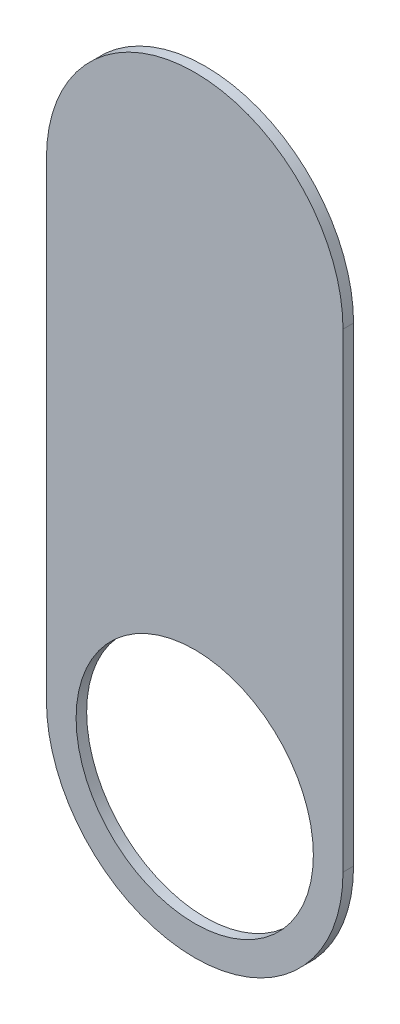
ISO-10303-21;
HEADER;
FILE_DESCRIPTION(('STEP AP214'),'2;1');
FILE_NAME('part.step','',(''),(''),'','','');
FILE_SCHEMA(('AUTOMOTIVE_DESIGN { 1 0 10303 214 1 1 1 1 }'));
ENDSEC;
DATA;
#1=APPLICATION_CONTEXT('core data for automotive mechanical design processes');
#2=APPLICATION_PROTOCOL_DEFINITION('international standard','automotive_design',2000,#1);
#3=PRODUCT_CONTEXT('',#1,'mechanical');
#4=PRODUCT('Part','Part','',(#3));
#5=PRODUCT_RELATED_PRODUCT_CATEGORY('part','',(#4));
#6=PRODUCT_DEFINITION_FORMATION('','',#4);
#7=PRODUCT_DEFINITION_CONTEXT('part definition',#1,'design');
#8=PRODUCT_DEFINITION('design','',#6,#7);
#9=PRODUCT_DEFINITION_SHAPE('','',#8);
#10=(LENGTH_UNIT() NAMED_UNIT(*) SI_UNIT(.MILLI.,.METRE.));
#11=(NAMED_UNIT(*) PLANE_ANGLE_UNIT() SI_UNIT($,.RADIAN.));
#12=(NAMED_UNIT(*) SI_UNIT($,.STERADIAN.) SOLID_ANGLE_UNIT());
#13=UNCERTAINTY_MEASURE_WITH_UNIT(LENGTH_MEASURE(1.E-05),#10,'distance_accuracy_value','');
#14=(GEOMETRIC_REPRESENTATION_CONTEXT(3) GLOBAL_UNCERTAINTY_ASSIGNED_CONTEXT((#13)) GLOBAL_UNIT_ASSIGNED_CONTEXT((#10,
#11,#12)) REPRESENTATION_CONTEXT('',''));
#15=CARTESIAN_POINT('',(0.,0.,0.));
#16=DIRECTION('',(0.,0.,1.));
#17=DIRECTION('',(1.,0.,0.));
#18=AXIS2_PLACEMENT_3D('',#15,#16,#17);
#19=CARTESIAN_POINT('',(57.920001,75.3000272,0.));
#20=DIRECTION('',(-1.,0.,0.));
#21=DIRECTION('',(0.,1.,0.));
#22=AXIS2_PLACEMENT_3D('',#19,#20,#21);
#23=PLANE('',#22);
#24=DIRECTION('',(0.,1.,0.));
#25=VECTOR('',#24,1.);
#26=CARTESIAN_POINT('',(57.920001,75.3000272,0.03556));
#27=LINE('',#26,#25);
#28=CARTESIAN_POINT('',(57.920001,75.3000272,0.03556));
#29=VERTEX_POINT('',#28);
#30=CARTESIAN_POINT('',(57.920001,76.8858,0.03556));
#31=VERTEX_POINT('',#30);
#32=EDGE_CURVE('E11',#29,#31,#27,.T.);
#33=ORIENTED_EDGE('',*,*,#32,.F.);
#34=DIRECTION('',(0.,0.,1.));
#35=VECTOR('',#34,1.);
#36=CARTESIAN_POINT('',(57.920001,75.3000272,0.));
#37=LINE('',#36,#35);
#38=CARTESIAN_POINT('',(57.920001,75.3000272,0.));
#39=VERTEX_POINT('',#38);
#40=EDGE_CURVE('E24',#39,#29,#37,.T.);
#41=ORIENTED_EDGE('',*,*,#40,.F.);
#42=DIRECTION('',(0.,1.,0.));
#43=VECTOR('',#42,1.);
#44=CARTESIAN_POINT('',(57.920001,75.3000272,0.));
#45=LINE('',#44,#43);
#46=CARTESIAN_POINT('',(57.920001,76.8858,0.));
#47=VERTEX_POINT('',#46);
#48=EDGE_CURVE('E96',#39,#47,#45,.T.);
#49=ORIENTED_EDGE('',*,*,#48,.T.);
#50=DIRECTION('',(0.,0.,1.));
#51=VECTOR('',#50,1.);
#52=CARTESIAN_POINT('',(57.920001,76.8858,0.));
#53=LINE('',#52,#51);
#54=EDGE_CURVE('E37',#47,#31,#53,.T.);
#55=ORIENTED_EDGE('',*,*,#54,.T.);
#56=EDGE_LOOP('',(#33,#41,#49,#55));
#57=FACE_BOUND('',#56,.T.);
#58=ADVANCED_FACE('F17',(#57),#23,.F.);
#59=CARTESIAN_POINT('',(57.420002,75.3000272,0.));
#60=DIRECTION('',(0.,0.,-1.));
#61=DIRECTION('',(-1.,0.,0.));
#62=AXIS2_PLACEMENT_3D('',#59,#60,#61);
#63=CYLINDRICAL_SURFACE('',#62,0.499999);
#64=CARTESIAN_POINT('',(57.420002,75.3000272,0.03556));
#65=DIRECTION('',(0.,0.,1.));
#66=DIRECTION('',(-1.,0.,0.));
#67=AXIS2_PLACEMENT_3D('',#64,#65,#66);
#68=CIRCLE('',#67,0.499999);
#69=CARTESIAN_POINT('',(56.920003,75.3000272,0.03556));
#70=VERTEX_POINT('',#69);
#71=EDGE_CURVE('E92',#70,#29,#68,.T.);
#72=ORIENTED_EDGE('',*,*,#71,.F.);
#73=DIRECTION('',(0.,0.,1.));
#74=VECTOR('',#73,1.);
#75=CARTESIAN_POINT('',(56.920003,75.3000272,0.));
#76=LINE('',#75,#74);
#77=CARTESIAN_POINT('',(56.920003,75.3000272,0.));
#78=VERTEX_POINT('',#77);
#79=EDGE_CURVE('E90',#78,#70,#76,.T.);
#80=ORIENTED_EDGE('',*,*,#79,.F.);
#81=CARTESIAN_POINT('',(57.420002,75.3000272,0.));
#82=DIRECTION('',(0.,0.,1.));
#83=DIRECTION('',(-1.,0.,0.));
#84=AXIS2_PLACEMENT_3D('',#81,#82,#83);
#85=CIRCLE('',#84,0.499999);
#86=EDGE_CURVE('E88',#78,#39,#85,.T.);
#87=ORIENTED_EDGE('',*,*,#86,.T.);
#88=ORIENTED_EDGE('',*,*,#40,.T.);
#89=EDGE_LOOP('',(#72,#80,#87,#88));
#90=FACE_BOUND('',#89,.T.);
#91=ADVANCED_FACE('F111',(#90),#63,.T.);
#92=CARTESIAN_POINT('',(57.420002,76.8858,0.));
#93=DIRECTION('',(0.,0.,-1.));
#94=DIRECTION('',(1.,0.,0.));
#95=AXIS2_PLACEMENT_3D('',#92,#93,#94);
#96=CYLINDRICAL_SURFACE('',#95,0.499999);
#97=CARTESIAN_POINT('',(57.420002,76.8858,0.03556));
#98=DIRECTION('',(0.,0.,1.));
#99=DIRECTION('',(1.,0.,0.));
#100=AXIS2_PLACEMENT_3D('',#97,#98,#99);
#101=CIRCLE('',#100,0.499999);
#102=CARTESIAN_POINT('',(56.920003,76.8858,0.03556));
#103=VERTEX_POINT('',#102);
#104=EDGE_CURVE('E85',#31,#103,#101,.T.);
#105=ORIENTED_EDGE('',*,*,#104,.F.);
#106=ORIENTED_EDGE('',*,*,#54,.F.);
#107=CARTESIAN_POINT('',(57.420002,76.8858,0.));
#108=DIRECTION('',(0.,0.,1.));
#109=DIRECTION('',(1.,0.,0.));
#110=AXIS2_PLACEMENT_3D('',#107,#108,#109);
#111=CIRCLE('',#110,0.499999);
#112=CARTESIAN_POINT('',(56.920003,76.8858,0.));
#113=VERTEX_POINT('',#112);
#114=EDGE_CURVE('E82',#47,#113,#111,.T.);
#115=ORIENTED_EDGE('',*,*,#114,.T.);
#116=DIRECTION('',(0.,0.,1.));
#117=VECTOR('',#116,1.);
#118=CARTESIAN_POINT('',(56.920003,76.8858,0.));
#119=LINE('',#118,#117);
#120=EDGE_CURVE('E80',#113,#103,#119,.T.);
#121=ORIENTED_EDGE('',*,*,#120,.T.);
#122=EDGE_LOOP('',(#105,#106,#115,#121));
#123=FACE_BOUND('',#122,.T.);
#124=ADVANCED_FACE('F104',(#123),#96,.T.);
#125=CARTESIAN_POINT('',(56.920003,76.8858,0.));
#126=DIRECTION('',(1.,0.,0.));
#127=DIRECTION('',(0.,-1.,0.));
#128=AXIS2_PLACEMENT_3D('',#125,#126,#127);
#129=PLANE('',#128);
#130=DIRECTION('',(0.,-1.,0.));
#131=VECTOR('',#130,1.);
#132=CARTESIAN_POINT('',(56.920003,76.8858,0.03556));
#133=LINE('',#132,#131);
#134=EDGE_CURVE('E77',#103,#70,#133,.T.);
#135=ORIENTED_EDGE('',*,*,#134,.F.);
#136=ORIENTED_EDGE('',*,*,#120,.F.);
#137=DIRECTION('',(0.,-1.,0.));
#138=VECTOR('',#137,1.);
#139=CARTESIAN_POINT('',(56.920003,76.8858,0.));
#140=LINE('',#139,#138);
#141=EDGE_CURVE('E68',#113,#78,#140,.T.);
#142=ORIENTED_EDGE('',*,*,#141,.T.);
#143=ORIENTED_EDGE('',*,*,#79,.T.);
#144=EDGE_LOOP('',(#135,#136,#142,#143));
#145=FACE_BOUND('',#144,.T.);
#146=ADVANCED_FACE('F110',(#145),#129,.F.);
#147=CARTESIAN_POINT('',(57.420002,75.3000272,0.));
#148=DIRECTION('',(0.,0.,-1.));
#149=DIRECTION('',(1.,0.,0.));
#150=AXIS2_PLACEMENT_3D('',#147,#148,#149);
#151=CYLINDRICAL_SURFACE('',#150,0.3999992);
#152=DIRECTION('',(0.,0.,1.));
#153=VECTOR('',#152,1.);
#154=CARTESIAN_POINT('',(57.8200012,75.3000272,0.));
#155=LINE('',#154,#153);
#156=CARTESIAN_POINT('',(57.8200012,75.3000272,0.));
#157=VERTEX_POINT('',#156);
#158=CARTESIAN_POINT('',(57.8200012,75.3000272,0.03556));
#159=VERTEX_POINT('',#158);
#160=EDGE_CURVE('E62',#157,#159,#155,.T.);
#161=ORIENTED_EDGE('',*,*,#160,.T.);
#162=CARTESIAN_POINT('',(57.420002,75.3000272,0.03556));
#163=DIRECTION('',(0.,0.,1.));
#164=DIRECTION('',(1.,0.,0.));
#165=AXIS2_PLACEMENT_3D('',#162,#163,#164);
#166=CIRCLE('',#165,0.3999992);
#167=EDGE_CURVE('E67',#159,#159,#166,.T.);
#168=ORIENTED_EDGE('',*,*,#167,.T.);
#169=ORIENTED_EDGE('',*,*,#160,.F.);
#170=CARTESIAN_POINT('',(57.420002,75.3000272,0.));
#171=DIRECTION('',(0.,0.,1.));
#172=DIRECTION('',(1.,0.,0.));
#173=AXIS2_PLACEMENT_3D('',#170,#171,#172);
#174=CIRCLE('',#173,0.3999992);
#175=EDGE_CURVE('E65',#157,#157,#174,.T.);
#176=ORIENTED_EDGE('',*,*,#175,.F.);
#177=EDGE_LOOP('',(#161,#168,#169,#176));
#178=FACE_BOUND('',#177,.T.);
#179=ADVANCED_FACE('F64',(#178),#151,.F.);
#180=CARTESIAN_POINT('',(57.920001,75.3000272,0.));
#181=DIRECTION('',(0.,0.,-1.));
#182=DIRECTION('',(-1.,0.,0.));
#183=AXIS2_PLACEMENT_3D('',#180,#181,#182);
#184=PLANE('',#183);
#185=ORIENTED_EDGE('',*,*,#48,.F.);
#186=ORIENTED_EDGE('',*,*,#86,.F.);
#187=ORIENTED_EDGE('',*,*,#141,.F.);
#188=ORIENTED_EDGE('',*,*,#114,.F.);
#189=EDGE_LOOP('',(#185,#186,#187,#188));
#190=FACE_BOUND('',#189,.T.);
#191=ORIENTED_EDGE('',*,*,#175,.T.);
#192=EDGE_LOOP('',(#191));
#193=FACE_BOUND('',#192,.T.);
#194=ADVANCED_FACE('F71',(#190,#193),#184,.T.);
#195=CARTESIAN_POINT('',(57.920001,75.3000272,0.03556));
#196=DIRECTION('',(0.,0.,-1.));
#197=DIRECTION('',(-1.,0.,0.));
#198=AXIS2_PLACEMENT_3D('',#195,#196,#197);
#199=PLANE('',#198);
#200=ORIENTED_EDGE('',*,*,#134,.T.);
#201=ORIENTED_EDGE('',*,*,#71,.T.);
#202=ORIENTED_EDGE('',*,*,#32,.T.);
#203=ORIENTED_EDGE('',*,*,#104,.T.);
#204=EDGE_LOOP('',(#200,#201,#202,#203));
#205=FACE_BOUND('',#204,.T.);
#206=ORIENTED_EDGE('',*,*,#167,.F.);
#207=EDGE_LOOP('',(#206));
#208=FACE_BOUND('',#207,.T.);
#209=ADVANCED_FACE('F107',(#205,#208),#199,.F.);
#210=CLOSED_SHELL('',(#58,#91,#124,#146,#179,#194,#209));
#211=MANIFOLD_SOLID_BREP('B1',#210);
#212=ADVANCED_BREP_SHAPE_REPRESENTATION('',(#18,#211),#14);
#213=SHAPE_DEFINITION_REPRESENTATION(#9,#212);
ENDSEC;
END-ISO-10303-21;
